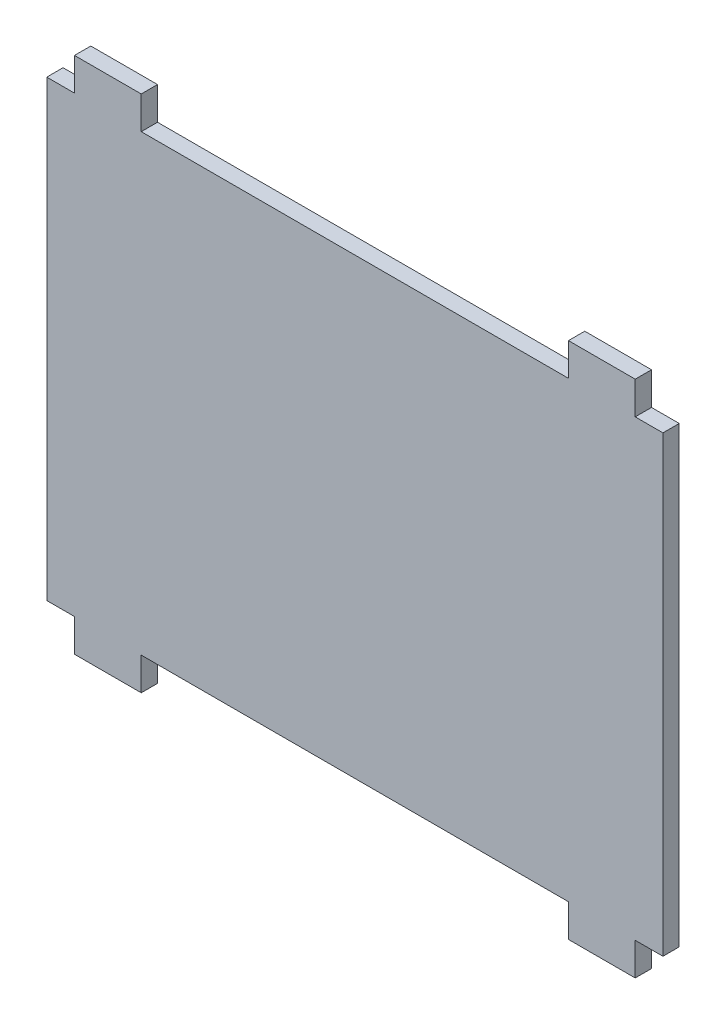
ISO-10303-21;
HEADER;
FILE_DESCRIPTION(('STEP AP214'),'2;1');
FILE_NAME('part.step','',(''),(''),'','','');
FILE_SCHEMA(('AUTOMOTIVE_DESIGN { 1 0 10303 214 1 1 1 1 }'));
ENDSEC;
DATA;
#1=APPLICATION_CONTEXT('core data for automotive mechanical design processes');
#2=APPLICATION_PROTOCOL_DEFINITION('international standard','automotive_design',2000,#1);
#3=PRODUCT_CONTEXT('',#1,'mechanical');
#4=PRODUCT('Part','Part','',(#3));
#5=PRODUCT_RELATED_PRODUCT_CATEGORY('part','',(#4));
#6=PRODUCT_DEFINITION_FORMATION('','',#4);
#7=PRODUCT_DEFINITION_CONTEXT('part definition',#1,'design');
#8=PRODUCT_DEFINITION('design','',#6,#7);
#9=PRODUCT_DEFINITION_SHAPE('','',#8);
#10=(LENGTH_UNIT() NAMED_UNIT(*) SI_UNIT(.MILLI.,.METRE.));
#11=(NAMED_UNIT(*) PLANE_ANGLE_UNIT() SI_UNIT($,.RADIAN.));
#12=(NAMED_UNIT(*) SI_UNIT($,.STERADIAN.) SOLID_ANGLE_UNIT());
#13=UNCERTAINTY_MEASURE_WITH_UNIT(LENGTH_MEASURE(1.E-05),#10,'distance_accuracy_value','');
#14=(GEOMETRIC_REPRESENTATION_CONTEXT(3) GLOBAL_UNCERTAINTY_ASSIGNED_CONTEXT((#13)) GLOBAL_UNIT_ASSIGNED_CONTEXT((#10,
#11,#12)) REPRESENTATION_CONTEXT('',''));
#15=CARTESIAN_POINT('',(0.,0.,0.));
#16=DIRECTION('',(0.,0.,1.));
#17=DIRECTION('',(1.,0.,0.));
#18=AXIS2_PLACEMENT_3D('',#15,#16,#17);
#19=CARTESIAN_POINT('',(-30.,0.,1.5875));
#20=DIRECTION('',(1.,0.,0.));
#21=DIRECTION('',(0.,0.,-1.));
#22=AXIS2_PLACEMENT_3D('',#19,#20,#21);
#23=PLANE('',#22);
#24=DIRECTION('',(0.,0.,-1.));
#25=VECTOR('',#24,1.);
#26=CARTESIAN_POINT('',(-30.,-22.07,1.5875));
#27=LINE('',#26,#25);
#28=CARTESIAN_POINT('',(-30.,-22.07,1.5875));
#29=VERTEX_POINT('',#28);
#30=CARTESIAN_POINT('',(-30.,-22.07,0.));
#31=VERTEX_POINT('',#30);
#32=EDGE_CURVE('E237',#29,#31,#27,.T.);
#33=ORIENTED_EDGE('',*,*,#32,.F.);
#34=DIRECTION('',(0.,-1.,0.));
#35=VECTOR('',#34,1.);
#36=CARTESIAN_POINT('',(-30.,0.,1.5875));
#37=LINE('',#36,#35);
#38=CARTESIAN_POINT('',(-30.,22.07,1.5875));
#39=VERTEX_POINT('',#38);
#40=EDGE_CURVE('E308',#39,#29,#37,.T.);
#41=ORIENTED_EDGE('',*,*,#40,.F.);
#42=DIRECTION('',(0.,0.,-1.));
#43=VECTOR('',#42,1.);
#44=CARTESIAN_POINT('',(-30.,22.07,1.5875));
#45=LINE('',#44,#43);
#46=CARTESIAN_POINT('',(-30.,22.07,0.));
#47=VERTEX_POINT('',#46);
#48=EDGE_CURVE('E304',#39,#47,#45,.T.);
#49=ORIENTED_EDGE('',*,*,#48,.T.);
#50=DIRECTION('',(0.,-1.,0.));
#51=VECTOR('',#50,1.);
#52=CARTESIAN_POINT('',(-30.,0.,0.));
#53=LINE('',#52,#51);
#54=EDGE_CURVE('E307',#47,#31,#53,.T.);
#55=ORIENTED_EDGE('',*,*,#54,.T.);
#56=EDGE_LOOP('',(#33,#41,#49,#55));
#57=FACE_BOUND('',#56,.T.);
#58=ADVANCED_FACE('F37',(#57),#23,.F.);
#59=CARTESIAN_POINT('',(30.,0.,1.5875));
#60=DIRECTION('',(-1.,0.,0.));
#61=DIRECTION('',(0.,0.,1.));
#62=AXIS2_PLACEMENT_3D('',#59,#60,#61);
#63=PLANE('',#62);
#64=DIRECTION('',(0.,0.,1.));
#65=VECTOR('',#64,1.);
#66=CARTESIAN_POINT('',(30.,-22.07,1.5875));
#67=LINE('',#66,#65);
#68=CARTESIAN_POINT('',(30.,-22.07,0.));
#69=VERTEX_POINT('',#68);
#70=CARTESIAN_POINT('',(30.,-22.07,1.5875));
#71=VERTEX_POINT('',#70);
#72=EDGE_CURVE('E230',#69,#71,#67,.T.);
#73=ORIENTED_EDGE('',*,*,#72,.F.);
#74=DIRECTION('',(0.,1.,0.));
#75=VECTOR('',#74,1.);
#76=CARTESIAN_POINT('',(30.,0.,0.));
#77=LINE('',#76,#75);
#78=CARTESIAN_POINT('',(30.,22.07,0.));
#79=VERTEX_POINT('',#78);
#80=EDGE_CURVE('E192',#69,#79,#77,.T.);
#81=ORIENTED_EDGE('',*,*,#80,.T.);
#82=DIRECTION('',(0.,0.,1.));
#83=VECTOR('',#82,1.);
#84=CARTESIAN_POINT('',(30.,22.07,1.5875));
#85=LINE('',#84,#83);
#86=CARTESIAN_POINT('',(30.,22.07,1.5875));
#87=VERTEX_POINT('',#86);
#88=EDGE_CURVE('E295',#79,#87,#85,.T.);
#89=ORIENTED_EDGE('',*,*,#88,.T.);
#90=DIRECTION('',(0.,1.,0.));
#91=VECTOR('',#90,1.);
#92=CARTESIAN_POINT('',(30.,0.,1.5875));
#93=LINE('',#92,#91);
#94=EDGE_CURVE('E311',#71,#87,#93,.T.);
#95=ORIENTED_EDGE('',*,*,#94,.F.);
#96=EDGE_LOOP('',(#73,#81,#89,#95));
#97=FACE_BOUND('',#96,.T.);
#98=ADVANCED_FACE('F350',(#97),#63,.F.);
#99=CARTESIAN_POINT('',(0.,0.,1.5875));
#100=DIRECTION('',(0.,0.,-1.));
#101=DIRECTION('',(-1.,0.,0.));
#102=AXIS2_PLACEMENT_3D('',#99,#100,#101);
#103=PLANE('',#102);
#104=DIRECTION('',(1.,0.,0.));
#105=VECTOR('',#104,1.);
#106=CARTESIAN_POINT('',(-32.7,-22.07,1.5875));
#107=LINE('',#106,#105);
#108=CARTESIAN_POINT('',(-27.3,-22.07,1.5875));
#109=VERTEX_POINT('',#108);
#110=EDGE_CURVE('E206',#29,#109,#107,.T.);
#111=ORIENTED_EDGE('',*,*,#110,.T.);
#112=DIRECTION('',(0.,-1.,0.));
#113=VECTOR('',#112,1.);
#114=CARTESIAN_POINT('',(-27.3,-25.25,1.5875));
#115=LINE('',#114,#113);
#116=CARTESIAN_POINT('',(-27.3,-25.25,1.5875));
#117=VERTEX_POINT('',#116);
#118=EDGE_CURVE('E203',#109,#117,#115,.T.);
#119=ORIENTED_EDGE('',*,*,#118,.T.);
#120=DIRECTION('',(-1.,0.,0.));
#121=VECTOR('',#120,1.);
#122=CARTESIAN_POINT('',(-30.,-25.25,1.5875));
#123=LINE('',#122,#121);
#124=CARTESIAN_POINT('',(-20.8,-25.25,1.5875));
#125=VERTEX_POINT('',#124);
#126=EDGE_CURVE('E240',#125,#117,#123,.T.);
#127=ORIENTED_EDGE('',*,*,#126,.F.);
#128=DIRECTION('',(0.,1.,0.));
#129=VECTOR('',#128,1.);
#130=CARTESIAN_POINT('',(-20.8,-25.25,1.5875));
#131=LINE('',#130,#129);
#132=CARTESIAN_POINT('',(-20.8,-22.07,1.5875));
#133=VERTEX_POINT('',#132);
#134=EDGE_CURVE('E51',#125,#133,#131,.T.);
#135=ORIENTED_EDGE('',*,*,#134,.T.);
#136=DIRECTION('',(1.,0.,0.));
#137=VECTOR('',#136,1.);
#138=CARTESIAN_POINT('',(-20.8,-22.07,1.5875));
#139=LINE('',#138,#137);
#140=CARTESIAN_POINT('',(20.8,-22.07,1.5875));
#141=VERTEX_POINT('',#140);
#142=EDGE_CURVE('E198',#133,#141,#139,.T.);
#143=ORIENTED_EDGE('',*,*,#142,.T.);
#144=DIRECTION('',(0.,-1.,0.));
#145=VECTOR('',#144,1.);
#146=CARTESIAN_POINT('',(20.8,-25.25,1.5875));
#147=LINE('',#146,#145);
#148=CARTESIAN_POINT('',(20.8,-25.25,1.5875));
#149=VERTEX_POINT('',#148);
#150=EDGE_CURVE('E217',#141,#149,#147,.T.);
#151=ORIENTED_EDGE('',*,*,#150,.T.);
#152=CARTESIAN_POINT('',(27.3,-25.25,1.5875));
#153=VERTEX_POINT('',#152);
#154=EDGE_CURVE('E243',#153,#149,#123,.T.);
#155=ORIENTED_EDGE('',*,*,#154,.F.);
#156=DIRECTION('',(0.,1.,0.));
#157=VECTOR('',#156,1.);
#158=CARTESIAN_POINT('',(27.3,-25.25,1.5875));
#159=LINE('',#158,#157);
#160=CARTESIAN_POINT('',(27.3,-22.07,1.5875));
#161=VERTEX_POINT('',#160);
#162=EDGE_CURVE('E59',#153,#161,#159,.T.);
#163=ORIENTED_EDGE('',*,*,#162,.T.);
#164=DIRECTION('',(1.,0.,0.));
#165=VECTOR('',#164,1.);
#166=CARTESIAN_POINT('',(27.3,-22.07,1.5875));
#167=LINE('',#166,#165);
#168=EDGE_CURVE('E186',#161,#71,#167,.T.);
#169=ORIENTED_EDGE('',*,*,#168,.T.);
#170=ORIENTED_EDGE('',*,*,#94,.T.);
#171=DIRECTION('',(1.,0.,0.));
#172=VECTOR('',#171,1.);
#173=CARTESIAN_POINT('',(27.3,22.07,1.5875));
#174=LINE('',#173,#172);
#175=CARTESIAN_POINT('',(27.3,22.07,1.5875));
#176=VERTEX_POINT('',#175);
#177=EDGE_CURVE('E254',#176,#87,#174,.T.);
#178=ORIENTED_EDGE('',*,*,#177,.F.);
#179=DIRECTION('',(0.,-1.,0.));
#180=VECTOR('',#179,1.);
#181=CARTESIAN_POINT('',(27.3,25.25,1.5875));
#182=LINE('',#181,#180);
#183=CARTESIAN_POINT('',(27.3,25.25,1.5875));
#184=VERTEX_POINT('',#183);
#185=EDGE_CURVE('E250',#184,#176,#182,.T.);
#186=ORIENTED_EDGE('',*,*,#185,.F.);
#187=DIRECTION('',(-1.,0.,0.));
#188=VECTOR('',#187,1.);
#189=CARTESIAN_POINT('',(-30.,25.25,1.5875));
#190=LINE('',#189,#188);
#191=CARTESIAN_POINT('',(20.8,25.25,1.5875));
#192=VERTEX_POINT('',#191);
#193=EDGE_CURVE('E44',#184,#192,#190,.T.);
#194=ORIENTED_EDGE('',*,*,#193,.T.);
#195=DIRECTION('',(0.,1.,0.));
#196=VECTOR('',#195,1.);
#197=CARTESIAN_POINT('',(20.8,25.25,1.5875));
#198=LINE('',#197,#196);
#199=CARTESIAN_POINT('',(20.8,22.07,1.5875));
#200=VERTEX_POINT('',#199);
#201=EDGE_CURVE('E289',#200,#192,#198,.T.);
#202=ORIENTED_EDGE('',*,*,#201,.F.);
#203=DIRECTION('',(1.,0.,0.));
#204=VECTOR('',#203,1.);
#205=CARTESIAN_POINT('',(-20.8,22.07,1.5875));
#206=LINE('',#205,#204);
#207=CARTESIAN_POINT('',(-20.8,22.07,1.5875));
#208=VERTEX_POINT('',#207);
#209=EDGE_CURVE('E262',#208,#200,#206,.T.);
#210=ORIENTED_EDGE('',*,*,#209,.F.);
#211=DIRECTION('',(0.,-1.,0.));
#212=VECTOR('',#211,1.);
#213=CARTESIAN_POINT('',(-20.8,25.25,1.5875));
#214=LINE('',#213,#212);
#215=CARTESIAN_POINT('',(-20.8,25.25,1.5875));
#216=VERTEX_POINT('',#215);
#217=EDGE_CURVE('E280',#216,#208,#214,.T.);
#218=ORIENTED_EDGE('',*,*,#217,.F.);
#219=CARTESIAN_POINT('',(-27.3,25.25,1.5875));
#220=VERTEX_POINT('',#219);
#221=EDGE_CURVE('E314',#216,#220,#190,.T.);
#222=ORIENTED_EDGE('',*,*,#221,.T.);
#223=DIRECTION('',(0.,1.,0.));
#224=VECTOR('',#223,1.);
#225=CARTESIAN_POINT('',(-27.3,25.25,1.5875));
#226=LINE('',#225,#224);
#227=CARTESIAN_POINT('',(-27.3,22.07,1.5875));
#228=VERTEX_POINT('',#227);
#229=EDGE_CURVE('E268',#228,#220,#226,.T.);
#230=ORIENTED_EDGE('',*,*,#229,.F.);
#231=DIRECTION('',(1.,0.,0.));
#232=VECTOR('',#231,1.);
#233=CARTESIAN_POINT('',(-32.7,22.07,1.5875));
#234=LINE('',#233,#232);
#235=EDGE_CURVE('E269',#39,#228,#234,.T.);
#236=ORIENTED_EDGE('',*,*,#235,.F.);
#237=ORIENTED_EDGE('',*,*,#40,.T.);
#238=EDGE_LOOP('',(#111,#119,#127,#135,#143,#151,#155,#163,#169,#170,#178,#186,#194,#202,#210,
#218,#222,#230,#236,#237));
#239=FACE_BOUND('',#238,.T.);
#240=ADVANCED_FACE('F338',(#239),#103,.F.);
#241=CARTESIAN_POINT('',(0.,0.,0.));
#242=DIRECTION('',(0.,0.,-1.));
#243=DIRECTION('',(-1.,0.,0.));
#244=AXIS2_PLACEMENT_3D('',#241,#242,#243);
#245=PLANE('',#244);
#246=DIRECTION('',(0.,-1.,0.));
#247=VECTOR('',#246,1.);
#248=CARTESIAN_POINT('',(-27.3,-25.25,0.));
#249=LINE('',#248,#247);
#250=CARTESIAN_POINT('',(-27.3,-22.07,0.));
#251=VERTEX_POINT('',#250);
#252=CARTESIAN_POINT('',(-27.3,-25.25,0.));
#253=VERTEX_POINT('',#252);
#254=EDGE_CURVE('E202',#251,#253,#249,.T.);
#255=ORIENTED_EDGE('',*,*,#254,.F.);
#256=DIRECTION('',(1.,0.,0.));
#257=VECTOR('',#256,1.);
#258=CARTESIAN_POINT('',(-32.7,-22.07,0.));
#259=LINE('',#258,#257);
#260=EDGE_CURVE('E200',#31,#251,#259,.T.);
#261=ORIENTED_EDGE('',*,*,#260,.F.);
#262=ORIENTED_EDGE('',*,*,#54,.F.);
#263=DIRECTION('',(-1.,0.,0.));
#264=VECTOR('',#263,1.);
#265=CARTESIAN_POINT('',(0.,22.07,0.));
#266=LINE('',#265,#264);
#267=CARTESIAN_POINT('',(-27.3,22.07,0.));
#268=VERTEX_POINT('',#267);
#269=EDGE_CURVE('E11',#268,#47,#266,.T.);
#270=ORIENTED_EDGE('',*,*,#269,.F.);
#271=DIRECTION('',(0.,1.,0.));
#272=VECTOR('',#271,1.);
#273=CARTESIAN_POINT('',(-27.3,25.25,0.));
#274=LINE('',#273,#272);
#275=CARTESIAN_POINT('',(-27.3,25.25,0.));
#276=VERTEX_POINT('',#275);
#277=EDGE_CURVE('E264',#268,#276,#274,.T.);
#278=ORIENTED_EDGE('',*,*,#277,.T.);
#279=DIRECTION('',(-1.,0.,0.));
#280=VECTOR('',#279,1.);
#281=CARTESIAN_POINT('',(-30.,25.25,0.));
#282=LINE('',#281,#280);
#283=CARTESIAN_POINT('',(-20.8,25.25,0.));
#284=VERTEX_POINT('',#283);
#285=EDGE_CURVE('E319',#284,#276,#282,.T.);
#286=ORIENTED_EDGE('',*,*,#285,.F.);
#287=DIRECTION('',(0.,-1.,0.));
#288=VECTOR('',#287,1.);
#289=CARTESIAN_POINT('',(-20.8,25.25,0.));
#290=LINE('',#289,#288);
#291=CARTESIAN_POINT('',(-20.8,22.07,0.));
#292=VERTEX_POINT('',#291);
#293=EDGE_CURVE('E283',#284,#292,#290,.T.);
#294=ORIENTED_EDGE('',*,*,#293,.T.);
#295=DIRECTION('',(1.,0.,0.));
#296=VECTOR('',#295,1.);
#297=CARTESIAN_POINT('',(-20.8,22.07,0.));
#298=LINE('',#297,#296);
#299=CARTESIAN_POINT('',(20.8,22.07,0.));
#300=VERTEX_POINT('',#299);
#301=EDGE_CURVE('E276',#292,#300,#298,.T.);
#302=ORIENTED_EDGE('',*,*,#301,.T.);
#303=DIRECTION('',(0.,1.,0.));
#304=VECTOR('',#303,1.);
#305=CARTESIAN_POINT('',(20.8,25.25,0.));
#306=LINE('',#305,#304);
#307=CARTESIAN_POINT('',(20.8,25.25,0.));
#308=VERTEX_POINT('',#307);
#309=EDGE_CURVE('E279',#300,#308,#306,.T.);
#310=ORIENTED_EDGE('',*,*,#309,.T.);
#311=CARTESIAN_POINT('',(27.3,25.25,0.));
#312=VERTEX_POINT('',#311);
#313=EDGE_CURVE('E312',#312,#308,#282,.T.);
#314=ORIENTED_EDGE('',*,*,#313,.F.);
#315=DIRECTION('',(0.,-1.,0.));
#316=VECTOR('',#315,1.);
#317=CARTESIAN_POINT('',(27.3,25.25,0.));
#318=LINE('',#317,#316);
#319=CARTESIAN_POINT('',(27.3,22.07,0.));
#320=VERTEX_POINT('',#319);
#321=EDGE_CURVE('E249',#312,#320,#318,.T.);
#322=ORIENTED_EDGE('',*,*,#321,.T.);
#323=DIRECTION('',(1.,0.,0.));
#324=VECTOR('',#323,1.);
#325=CARTESIAN_POINT('',(27.3,22.07,0.));
#326=LINE('',#325,#324);
#327=EDGE_CURVE('E247',#320,#79,#326,.T.);
#328=ORIENTED_EDGE('',*,*,#327,.T.);
#329=ORIENTED_EDGE('',*,*,#80,.F.);
#330=DIRECTION('',(1.,0.,0.));
#331=VECTOR('',#330,1.);
#332=CARTESIAN_POINT('',(27.3,-22.07,0.));
#333=LINE('',#332,#331);
#334=CARTESIAN_POINT('',(27.3,-22.07,0.));
#335=VERTEX_POINT('',#334);
#336=EDGE_CURVE('E180',#335,#69,#333,.T.);
#337=ORIENTED_EDGE('',*,*,#336,.F.);
#338=DIRECTION('',(0.,1.,0.));
#339=VECTOR('',#338,1.);
#340=CARTESIAN_POINT('',(27.3,-25.25,0.));
#341=LINE('',#340,#339);
#342=CARTESIAN_POINT('',(27.3,-25.25,0.));
#343=VERTEX_POINT('',#342);
#344=EDGE_CURVE('E170',#343,#335,#341,.T.);
#345=ORIENTED_EDGE('',*,*,#344,.F.);
#346=DIRECTION('',(-1.,0.,0.));
#347=VECTOR('',#346,1.);
#348=CARTESIAN_POINT('',(-30.,-25.25,0.));
#349=LINE('',#348,#347);
#350=CARTESIAN_POINT('',(20.8,-25.25,0.));
#351=VERTEX_POINT('',#350);
#352=EDGE_CURVE('E244',#343,#351,#349,.T.);
#353=ORIENTED_EDGE('',*,*,#352,.T.);
#354=DIRECTION('',(0.,-1.,0.));
#355=VECTOR('',#354,1.);
#356=CARTESIAN_POINT('',(20.8,-25.25,0.));
#357=LINE('',#356,#355);
#358=CARTESIAN_POINT('',(20.8,-22.07,0.));
#359=VERTEX_POINT('',#358);
#360=EDGE_CURVE('E219',#359,#351,#357,.T.);
#361=ORIENTED_EDGE('',*,*,#360,.F.);
#362=DIRECTION('',(1.,0.,0.));
#363=VECTOR('',#362,1.);
#364=CARTESIAN_POINT('',(-20.8,-22.07,0.));
#365=LINE('',#364,#363);
#366=CARTESIAN_POINT('',(-20.8,-22.07,0.));
#367=VERTEX_POINT('',#366);
#368=EDGE_CURVE('E214',#367,#359,#365,.T.);
#369=ORIENTED_EDGE('',*,*,#368,.F.);
#370=DIRECTION('',(0.,1.,0.));
#371=VECTOR('',#370,1.);
#372=CARTESIAN_POINT('',(-20.8,-25.25,0.));
#373=LINE('',#372,#371);
#374=CARTESIAN_POINT('',(-20.8,-25.25,0.));
#375=VERTEX_POINT('',#374);
#376=EDGE_CURVE('E216',#375,#367,#373,.T.);
#377=ORIENTED_EDGE('',*,*,#376,.F.);
#378=EDGE_CURVE('E239',#375,#253,#349,.T.);
#379=ORIENTED_EDGE('',*,*,#378,.T.);
#380=EDGE_LOOP('',(#255,#261,#262,#270,#278,#286,#294,#302,#310,#314,#322,#328,#329,#337,#345,
#353,#361,#369,#377,#379));
#381=FACE_BOUND('',#380,.T.);
#382=ADVANCED_FACE('F190',(#381),#245,.T.);
#383=CARTESIAN_POINT('',(-30.,-25.25,1.5875));
#384=DIRECTION('',(0.,-1.,0.));
#385=DIRECTION('',(0.,0.,-1.));
#386=AXIS2_PLACEMENT_3D('',#383,#384,#385);
#387=PLANE('',#386);
#388=ORIENTED_EDGE('',*,*,#126,.T.);
#389=DIRECTION('',(0.,0.,1.));
#390=VECTOR('',#389,1.);
#391=CARTESIAN_POINT('',(-27.3,-25.25,0.));
#392=LINE('',#391,#390);
#393=EDGE_CURVE('E205',#253,#117,#392,.T.);
#394=ORIENTED_EDGE('',*,*,#393,.F.);
#395=ORIENTED_EDGE('',*,*,#378,.F.);
#396=DIRECTION('',(0.,0.,1.));
#397=VECTOR('',#396,1.);
#398=CARTESIAN_POINT('',(-20.8,-25.25,0.));
#399=LINE('',#398,#397);
#400=EDGE_CURVE('E233',#375,#125,#399,.T.);
#401=ORIENTED_EDGE('',*,*,#400,.T.);
#402=EDGE_LOOP('',(#388,#394,#395,#401));
#403=FACE_BOUND('',#402,.T.);
#404=ADVANCED_FACE('F369',(#403),#387,.T.);
#405=ORIENTED_EDGE('',*,*,#352,.F.);
#406=DIRECTION('',(0.,0.,1.));
#407=VECTOR('',#406,1.);
#408=CARTESIAN_POINT('',(27.3,-25.25,0.));
#409=LINE('',#408,#407);
#410=EDGE_CURVE('E175',#343,#153,#409,.T.);
#411=ORIENTED_EDGE('',*,*,#410,.T.);
#412=ORIENTED_EDGE('',*,*,#154,.T.);
#413=DIRECTION('',(0.,0.,1.));
#414=VECTOR('',#413,1.);
#415=CARTESIAN_POINT('',(20.8,-25.25,0.));
#416=LINE('',#415,#414);
#417=EDGE_CURVE('E231',#351,#149,#416,.T.);
#418=ORIENTED_EDGE('',*,*,#417,.F.);
#419=EDGE_LOOP('',(#405,#411,#412,#418));
#420=FACE_BOUND('',#419,.T.);
#421=ADVANCED_FACE('F355',(#420),#387,.T.);
#422=CARTESIAN_POINT('',(-30.,25.25,1.5875));
#423=DIRECTION('',(0.,-1.,0.));
#424=DIRECTION('',(0.,0.,-1.));
#425=AXIS2_PLACEMENT_3D('',#422,#423,#424);
#426=PLANE('',#425);
#427=ORIENTED_EDGE('',*,*,#285,.T.);
#428=DIRECTION('',(0.,0.,1.));
#429=VECTOR('',#428,1.);
#430=CARTESIAN_POINT('',(-27.3,25.25,0.));
#431=LINE('',#430,#429);
#432=EDGE_CURVE('E257',#276,#220,#431,.T.);
#433=ORIENTED_EDGE('',*,*,#432,.T.);
#434=ORIENTED_EDGE('',*,*,#221,.F.);
#435=DIRECTION('',(0.,0.,1.));
#436=VECTOR('',#435,1.);
#437=CARTESIAN_POINT('',(-20.8,25.25,0.));
#438=LINE('',#437,#436);
#439=EDGE_CURVE('E296',#284,#216,#438,.T.);
#440=ORIENTED_EDGE('',*,*,#439,.F.);
#441=EDGE_LOOP('',(#427,#433,#434,#440));
#442=FACE_BOUND('',#441,.T.);
#443=ADVANCED_FACE('F391',(#442),#426,.F.);
#444=ORIENTED_EDGE('',*,*,#193,.F.);
#445=DIRECTION('',(0.,0.,1.));
#446=VECTOR('',#445,1.);
#447=CARTESIAN_POINT('',(27.3,25.25,0.));
#448=LINE('',#447,#446);
#449=EDGE_CURVE('E253',#312,#184,#448,.T.);
#450=ORIENTED_EDGE('',*,*,#449,.F.);
#451=ORIENTED_EDGE('',*,*,#313,.T.);
#452=DIRECTION('',(0.,0.,1.));
#453=VECTOR('',#452,1.);
#454=CARTESIAN_POINT('',(20.8,25.25,0.));
#455=LINE('',#454,#453);
#456=EDGE_CURVE('E298',#308,#192,#455,.T.);
#457=ORIENTED_EDGE('',*,*,#456,.T.);
#458=EDGE_LOOP('',(#444,#450,#451,#457));
#459=FACE_BOUND('',#458,.T.);
#460=ADVANCED_FACE('F329',(#459),#426,.F.);
#461=CARTESIAN_POINT('',(-20.8,22.07,0.));
#462=DIRECTION('',(0.,-1.,0.));
#463=DIRECTION('',(1.,0.,0.));
#464=AXIS2_PLACEMENT_3D('',#461,#462,#463);
#465=PLANE('',#464);
#466=ORIENTED_EDGE('',*,*,#209,.T.);
#467=DIRECTION('',(0.,0.,1.));
#468=VECTOR('',#467,1.);
#469=CARTESIAN_POINT('',(20.8,22.07,0.));
#470=LINE('',#469,#468);
#471=EDGE_CURVE('E286',#300,#200,#470,.T.);
#472=ORIENTED_EDGE('',*,*,#471,.F.);
#473=ORIENTED_EDGE('',*,*,#301,.F.);
#474=DIRECTION('',(0.,0.,1.));
#475=VECTOR('',#474,1.);
#476=CARTESIAN_POINT('',(-20.8,22.07,0.));
#477=LINE('',#476,#475);
#478=EDGE_CURVE('E293',#292,#208,#477,.T.);
#479=ORIENTED_EDGE('',*,*,#478,.T.);
#480=EDGE_LOOP('',(#466,#472,#473,#479));
#481=FACE_BOUND('',#480,.T.);
#482=ADVANCED_FACE('F395',(#481),#465,.F.);
#483=CARTESIAN_POINT('',(-20.8,25.25,0.));
#484=DIRECTION('',(-1.,0.,0.));
#485=DIRECTION('',(0.,0.,1.));
#486=AXIS2_PLACEMENT_3D('',#483,#484,#485);
#487=PLANE('',#486);
#488=ORIENTED_EDGE('',*,*,#217,.T.);
#489=ORIENTED_EDGE('',*,*,#478,.F.);
#490=ORIENTED_EDGE('',*,*,#293,.F.);
#491=ORIENTED_EDGE('',*,*,#439,.T.);
#492=EDGE_LOOP('',(#488,#489,#490,#491));
#493=FACE_BOUND('',#492,.T.);
#494=ADVANCED_FACE('F393',(#493),#487,.F.);
#495=CARTESIAN_POINT('',(20.8,25.25,0.));
#496=DIRECTION('',(1.,0.,0.));
#497=DIRECTION('',(0.,0.,-1.));
#498=AXIS2_PLACEMENT_3D('',#495,#496,#497);
#499=PLANE('',#498);
#500=ORIENTED_EDGE('',*,*,#201,.T.);
#501=ORIENTED_EDGE('',*,*,#456,.F.);
#502=ORIENTED_EDGE('',*,*,#309,.F.);
#503=ORIENTED_EDGE('',*,*,#471,.T.);
#504=EDGE_LOOP('',(#500,#501,#502,#503));
#505=FACE_BOUND('',#504,.T.);
#506=ADVANCED_FACE('F334',(#505),#499,.F.);
#507=CARTESIAN_POINT('',(27.3,22.07,0.));
#508=DIRECTION('',(0.,-1.,0.));
#509=DIRECTION('',(0.,0.,-1.));
#510=AXIS2_PLACEMENT_3D('',#507,#508,#509);
#511=PLANE('',#510);
#512=ORIENTED_EDGE('',*,*,#327,.F.);
#513=DIRECTION('',(0.,0.,1.));
#514=VECTOR('',#513,1.);
#515=CARTESIAN_POINT('',(27.3,22.07,0.));
#516=LINE('',#515,#514);
#517=EDGE_CURVE('E260',#320,#176,#516,.T.);
#518=ORIENTED_EDGE('',*,*,#517,.T.);
#519=ORIENTED_EDGE('',*,*,#177,.T.);
#520=ORIENTED_EDGE('',*,*,#88,.F.);
#521=EDGE_LOOP('',(#512,#518,#519,#520));
#522=FACE_BOUND('',#521,.T.);
#523=ADVANCED_FACE('F346',(#522),#511,.F.);
#524=CARTESIAN_POINT('',(27.3,25.25,0.));
#525=DIRECTION('',(-1.,0.,0.));
#526=DIRECTION('',(0.,0.,1.));
#527=AXIS2_PLACEMENT_3D('',#524,#525,#526);
#528=PLANE('',#527);
#529=ORIENTED_EDGE('',*,*,#185,.T.);
#530=ORIENTED_EDGE('',*,*,#517,.F.);
#531=ORIENTED_EDGE('',*,*,#321,.F.);
#532=ORIENTED_EDGE('',*,*,#449,.T.);
#533=EDGE_LOOP('',(#529,#530,#531,#532));
#534=FACE_BOUND('',#533,.T.);
#535=ADVANCED_FACE('F344',(#534),#528,.F.);
#536=CARTESIAN_POINT('',(-32.7,22.07,0.));
#537=DIRECTION('',(0.,-1.,0.));
#538=DIRECTION('',(0.,0.,-1.));
#539=AXIS2_PLACEMENT_3D('',#536,#537,#538);
#540=PLANE('',#539);
#541=ORIENTED_EDGE('',*,*,#235,.T.);
#542=DIRECTION('',(0.,0.,1.));
#543=VECTOR('',#542,1.);
#544=CARTESIAN_POINT('',(-27.3,22.07,0.));
#545=LINE('',#544,#543);
#546=EDGE_CURVE('E267',#268,#228,#545,.T.);
#547=ORIENTED_EDGE('',*,*,#546,.F.);
#548=ORIENTED_EDGE('',*,*,#269,.T.);
#549=ORIENTED_EDGE('',*,*,#48,.F.);
#550=EDGE_LOOP('',(#541,#547,#548,#549));
#551=FACE_BOUND('',#550,.T.);
#552=ADVANCED_FACE('F387',(#551),#540,.F.);
#553=CARTESIAN_POINT('',(-27.3,25.25,0.));
#554=DIRECTION('',(1.,0.,0.));
#555=DIRECTION('',(0.,0.,-1.));
#556=AXIS2_PLACEMENT_3D('',#553,#554,#555);
#557=PLANE('',#556);
#558=ORIENTED_EDGE('',*,*,#229,.T.);
#559=ORIENTED_EDGE('',*,*,#432,.F.);
#560=ORIENTED_EDGE('',*,*,#277,.F.);
#561=ORIENTED_EDGE('',*,*,#546,.T.);
#562=EDGE_LOOP('',(#558,#559,#560,#561));
#563=FACE_BOUND('',#562,.T.);
#564=ADVANCED_FACE('F389',(#563),#557,.F.);
#565=CARTESIAN_POINT('',(-20.8,-22.07,0.));
#566=DIRECTION('',(0.,-1.,0.));
#567=DIRECTION('',(1.,0.,0.));
#568=AXIS2_PLACEMENT_3D('',#565,#566,#567);
#569=PLANE('',#568);
#570=ORIENTED_EDGE('',*,*,#142,.F.);
#571=DIRECTION('',(0.,0.,1.));
#572=VECTOR('',#571,1.);
#573=CARTESIAN_POINT('',(-20.8,-22.07,0.));
#574=LINE('',#573,#572);
#575=EDGE_CURVE('E221',#367,#133,#574,.T.);
#576=ORIENTED_EDGE('',*,*,#575,.F.);
#577=ORIENTED_EDGE('',*,*,#368,.T.);
#578=DIRECTION('',(0.,0.,1.));
#579=VECTOR('',#578,1.);
#580=CARTESIAN_POINT('',(20.8,-22.07,0.));
#581=LINE('',#580,#579);
#582=EDGE_CURVE('E227',#359,#141,#581,.T.);
#583=ORIENTED_EDGE('',*,*,#582,.T.);
#584=EDGE_LOOP('',(#570,#576,#577,#583));
#585=FACE_BOUND('',#584,.T.);
#586=ADVANCED_FACE('F364',(#585),#569,.T.);
#587=CARTESIAN_POINT('',(20.8,-25.25,0.));
#588=DIRECTION('',(-1.,0.,0.));
#589=DIRECTION('',(0.,0.,1.));
#590=AXIS2_PLACEMENT_3D('',#587,#588,#589);
#591=PLANE('',#590);
#592=ORIENTED_EDGE('',*,*,#150,.F.);
#593=ORIENTED_EDGE('',*,*,#582,.F.);
#594=ORIENTED_EDGE('',*,*,#360,.T.);
#595=ORIENTED_EDGE('',*,*,#417,.T.);
#596=EDGE_LOOP('',(#592,#593,#594,#595));
#597=FACE_BOUND('',#596,.T.);
#598=ADVANCED_FACE('F361',(#597),#591,.T.);
#599=CARTESIAN_POINT('',(-20.8,-25.25,0.));
#600=DIRECTION('',(1.,0.,0.));
#601=DIRECTION('',(0.,0.,-1.));
#602=AXIS2_PLACEMENT_3D('',#599,#600,#601);
#603=PLANE('',#602);
#604=ORIENTED_EDGE('',*,*,#134,.F.);
#605=ORIENTED_EDGE('',*,*,#400,.F.);
#606=ORIENTED_EDGE('',*,*,#376,.T.);
#607=ORIENTED_EDGE('',*,*,#575,.T.);
#608=EDGE_LOOP('',(#604,#605,#606,#607));
#609=FACE_BOUND('',#608,.T.);
#610=ADVANCED_FACE('F371',(#609),#603,.T.);
#611=CARTESIAN_POINT('',(27.3,-22.07,0.));
#612=DIRECTION('',(0.,-1.,0.));
#613=DIRECTION('',(0.,0.,-1.));
#614=AXIS2_PLACEMENT_3D('',#611,#612,#613);
#615=PLANE('',#614);
#616=ORIENTED_EDGE('',*,*,#72,.T.);
#617=ORIENTED_EDGE('',*,*,#168,.F.);
#618=DIRECTION('',(0.,0.,1.));
#619=VECTOR('',#618,1.);
#620=CARTESIAN_POINT('',(27.3,-22.07,0.));
#621=LINE('',#620,#619);
#622=EDGE_CURVE('E173',#335,#161,#621,.T.);
#623=ORIENTED_EDGE('',*,*,#622,.F.);
#624=ORIENTED_EDGE('',*,*,#336,.T.);
#625=EDGE_LOOP('',(#616,#617,#623,#624));
#626=FACE_BOUND('',#625,.T.);
#627=ADVANCED_FACE('F183',(#626),#615,.T.);
#628=CARTESIAN_POINT('',(27.3,-25.25,0.));
#629=DIRECTION('',(1.,0.,0.));
#630=DIRECTION('',(0.,0.,-1.));
#631=AXIS2_PLACEMENT_3D('',#628,#629,#630);
#632=PLANE('',#631);
#633=ORIENTED_EDGE('',*,*,#162,.F.);
#634=ORIENTED_EDGE('',*,*,#410,.F.);
#635=ORIENTED_EDGE('',*,*,#344,.T.);
#636=ORIENTED_EDGE('',*,*,#622,.T.);
#637=EDGE_LOOP('',(#633,#634,#635,#636));
#638=FACE_BOUND('',#637,.T.);
#639=ADVANCED_FACE('F172',(#638),#632,.T.);
#640=CARTESIAN_POINT('',(-32.7,-22.07,0.));
#641=DIRECTION('',(0.,-1.,0.));
#642=DIRECTION('',(0.,0.,-1.));
#643=AXIS2_PLACEMENT_3D('',#640,#641,#642);
#644=PLANE('',#643);
#645=ORIENTED_EDGE('',*,*,#32,.T.);
#646=ORIENTED_EDGE('',*,*,#260,.T.);
#647=DIRECTION('',(0.,0.,1.));
#648=VECTOR('',#647,1.);
#649=CARTESIAN_POINT('',(-27.3,-22.07,0.));
#650=LINE('',#649,#648);
#651=EDGE_CURVE('E196',#251,#109,#650,.T.);
#652=ORIENTED_EDGE('',*,*,#651,.T.);
#653=ORIENTED_EDGE('',*,*,#110,.F.);
#654=EDGE_LOOP('',(#645,#646,#652,#653));
#655=FACE_BOUND('',#654,.T.);
#656=ADVANCED_FACE('F378',(#655),#644,.T.);
#657=CARTESIAN_POINT('',(-27.3,-25.25,0.));
#658=DIRECTION('',(-1.,0.,0.));
#659=DIRECTION('',(0.,0.,1.));
#660=AXIS2_PLACEMENT_3D('',#657,#658,#659);
#661=PLANE('',#660);
#662=ORIENTED_EDGE('',*,*,#118,.F.);
#663=ORIENTED_EDGE('',*,*,#651,.F.);
#664=ORIENTED_EDGE('',*,*,#254,.T.);
#665=ORIENTED_EDGE('',*,*,#393,.T.);
#666=EDGE_LOOP('',(#662,#663,#664,#665));
#667=FACE_BOUND('',#666,.T.);
#668=ADVANCED_FACE('F376',(#667),#661,.T.);
#669=CLOSED_SHELL('',(#58,#98,#240,#382,#404,#421,#443,#460,#482,#494,#506,#523,#535,#552,#564,
#586,#598,#610,#627,#639,#656,#668));
#670=MANIFOLD_SOLID_BREP('B2',#669);
#671=ADVANCED_BREP_SHAPE_REPRESENTATION('',(#18,#670),#14);
#672=SHAPE_DEFINITION_REPRESENTATION(#9,#671);
ENDSEC;
END-ISO-10303-21;
